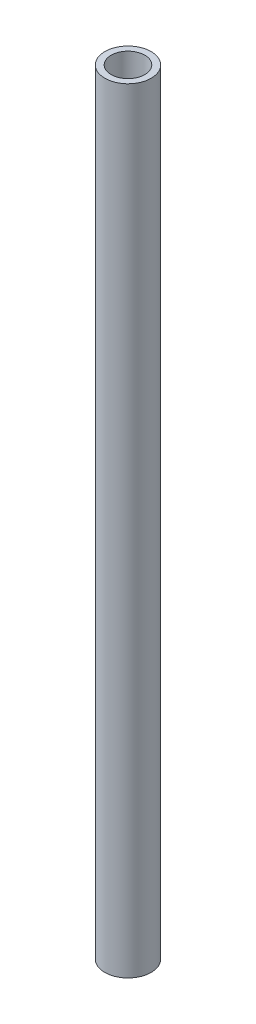
ISO-10303-21;
HEADER;
FILE_DESCRIPTION(('STEP AP214'),'2;1');
FILE_NAME('part.step','',(''),(''),'','','');
FILE_SCHEMA(('AUTOMOTIVE_DESIGN { 1 0 10303 214 1 1 1 1 }'));
ENDSEC;
DATA;
#1=APPLICATION_CONTEXT('core data for automotive mechanical design processes');
#2=APPLICATION_PROTOCOL_DEFINITION('international standard','automotive_design',2000,#1);
#3=PRODUCT_CONTEXT('',#1,'mechanical');
#4=PRODUCT('Part','Part','',(#3));
#5=PRODUCT_RELATED_PRODUCT_CATEGORY('part','',(#4));
#6=PRODUCT_DEFINITION_FORMATION('','',#4);
#7=PRODUCT_DEFINITION_CONTEXT('part definition',#1,'design');
#8=PRODUCT_DEFINITION('design','',#6,#7);
#9=PRODUCT_DEFINITION_SHAPE('','',#8);
#10=(LENGTH_UNIT() NAMED_UNIT(*) SI_UNIT(.MILLI.,.METRE.));
#11=(NAMED_UNIT(*) PLANE_ANGLE_UNIT() SI_UNIT($,.RADIAN.));
#12=(NAMED_UNIT(*) SI_UNIT($,.STERADIAN.) SOLID_ANGLE_UNIT());
#13=UNCERTAINTY_MEASURE_WITH_UNIT(LENGTH_MEASURE(1.E-05),#10,'distance_accuracy_value','');
#14=(GEOMETRIC_REPRESENTATION_CONTEXT(3) GLOBAL_UNCERTAINTY_ASSIGNED_CONTEXT((#13)) GLOBAL_UNIT_ASSIGNED_CONTEXT((#10,
#11,#12)) REPRESENTATION_CONTEXT('',''));
#15=CARTESIAN_POINT('',(0.,0.,0.));
#16=DIRECTION('',(0.,0.,1.));
#17=DIRECTION('',(1.,0.,0.));
#18=AXIS2_PLACEMENT_3D('',#15,#16,#17);
#19=CARTESIAN_POINT('',(0.,279.4,0.));
#20=DIRECTION('',(0.,1.,0.));
#21=DIRECTION('',(0.,0.,1.));
#22=AXIS2_PLACEMENT_3D('',#19,#20,#21);
#23=PLANE('',#22);
#24=CARTESIAN_POINT('',(0.,279.4,0.));
#25=DIRECTION('',(0.,1.,0.));
#26=DIRECTION('',(0.,0.,1.));
#27=AXIS2_PLACEMENT_3D('',#24,#25,#26);
#28=CIRCLE('',#27,16.7005);
#29=CARTESIAN_POINT('',(0.,279.4,16.7005));
#30=VERTEX_POINT('',#29);
#31=EDGE_CURVE('E10',#30,#30,#28,.T.);
#32=ORIENTED_EDGE('',*,*,#31,.T.);
#33=EDGE_LOOP('',(#32));
#34=FACE_BOUND('',#33,.T.);
#35=CARTESIAN_POINT('',(0.,279.4,0.));
#36=DIRECTION('',(0.,1.,0.));
#37=DIRECTION('',(0.,0.,1.));
#38=AXIS2_PLACEMENT_3D('',#35,#36,#37);
#39=CIRCLE('',#38,12.1539);
#40=CARTESIAN_POINT('',(0.,279.4,12.1539));
#41=VERTEX_POINT('',#40);
#42=EDGE_CURVE('E43',#41,#41,#39,.T.);
#43=ORIENTED_EDGE('',*,*,#42,.F.);
#44=EDGE_LOOP('',(#43));
#45=FACE_BOUND('',#44,.T.);
#46=ADVANCED_FACE('F32',(#34,#45),#23,.T.);
#47=CARTESIAN_POINT('',(0.,-279.4,0.));
#48=DIRECTION('',(0.,1.,0.));
#49=DIRECTION('',(0.,0.,1.));
#50=AXIS2_PLACEMENT_3D('',#47,#48,#49);
#51=PLANE('',#50);
#52=CARTESIAN_POINT('',(0.,-279.4,0.));
#53=DIRECTION('',(0.,1.,0.));
#54=DIRECTION('',(0.,0.,1.));
#55=AXIS2_PLACEMENT_3D('',#52,#53,#54);
#56=CIRCLE('',#55,16.7005);
#57=CARTESIAN_POINT('',(0.,-279.4,16.7005));
#58=VERTEX_POINT('',#57);
#59=EDGE_CURVE('E36',#58,#58,#56,.T.);
#60=ORIENTED_EDGE('',*,*,#59,.F.);
#61=EDGE_LOOP('',(#60));
#62=FACE_BOUND('',#61,.T.);
#63=CARTESIAN_POINT('',(0.,-279.4,0.));
#64=DIRECTION('',(0.,1.,0.));
#65=DIRECTION('',(0.,0.,1.));
#66=AXIS2_PLACEMENT_3D('',#63,#64,#65);
#67=CIRCLE('',#66,12.1539);
#68=CARTESIAN_POINT('',(0.,-279.4,12.1539));
#69=VERTEX_POINT('',#68);
#70=EDGE_CURVE('E45',#69,#69,#67,.T.);
#71=ORIENTED_EDGE('',*,*,#70,.T.);
#72=EDGE_LOOP('',(#71));
#73=FACE_BOUND('',#72,.T.);
#74=ADVANCED_FACE('F55',(#62,#73),#51,.F.);
#75=CARTESIAN_POINT('',(0.,279.4,0.));
#76=DIRECTION('',(0.,-1.,0.));
#77=DIRECTION('',(0.,0.,-1.));
#78=AXIS2_PLACEMENT_3D('',#75,#76,#77);
#79=CYLINDRICAL_SURFACE('',#78,16.7005);
#80=ORIENTED_EDGE('',*,*,#31,.F.);
#81=EDGE_LOOP('',(#80));
#82=FACE_BOUND('',#81,.T.);
#83=ORIENTED_EDGE('',*,*,#59,.T.);
#84=EDGE_LOOP('',(#83));
#85=FACE_BOUND('',#84,.T.);
#86=ADVANCED_FACE('F34',(#82,#85),#79,.T.);
#87=CARTESIAN_POINT('',(0.,279.4,0.));
#88=DIRECTION('',(0.,-1.,0.));
#89=DIRECTION('',(0.,0.,-1.));
#90=AXIS2_PLACEMENT_3D('',#87,#88,#89);
#91=CYLINDRICAL_SURFACE('',#90,12.1539);
#92=ORIENTED_EDGE('',*,*,#42,.T.);
#93=EDGE_LOOP('',(#92));
#94=FACE_BOUND('',#93,.T.);
#95=ORIENTED_EDGE('',*,*,#70,.F.);
#96=EDGE_LOOP('',(#95));
#97=FACE_BOUND('',#96,.T.);
#98=ADVANCED_FACE('F51',(#94,#97),#91,.F.);
#99=CLOSED_SHELL('',(#46,#74,#86,#98));
#100=MANIFOLD_SOLID_BREP('B2',#99);
#101=ADVANCED_BREP_SHAPE_REPRESENTATION('',(#18,#100),#14);
#102=SHAPE_DEFINITION_REPRESENTATION(#9,#101);
ENDSEC;
END-ISO-10303-21;
